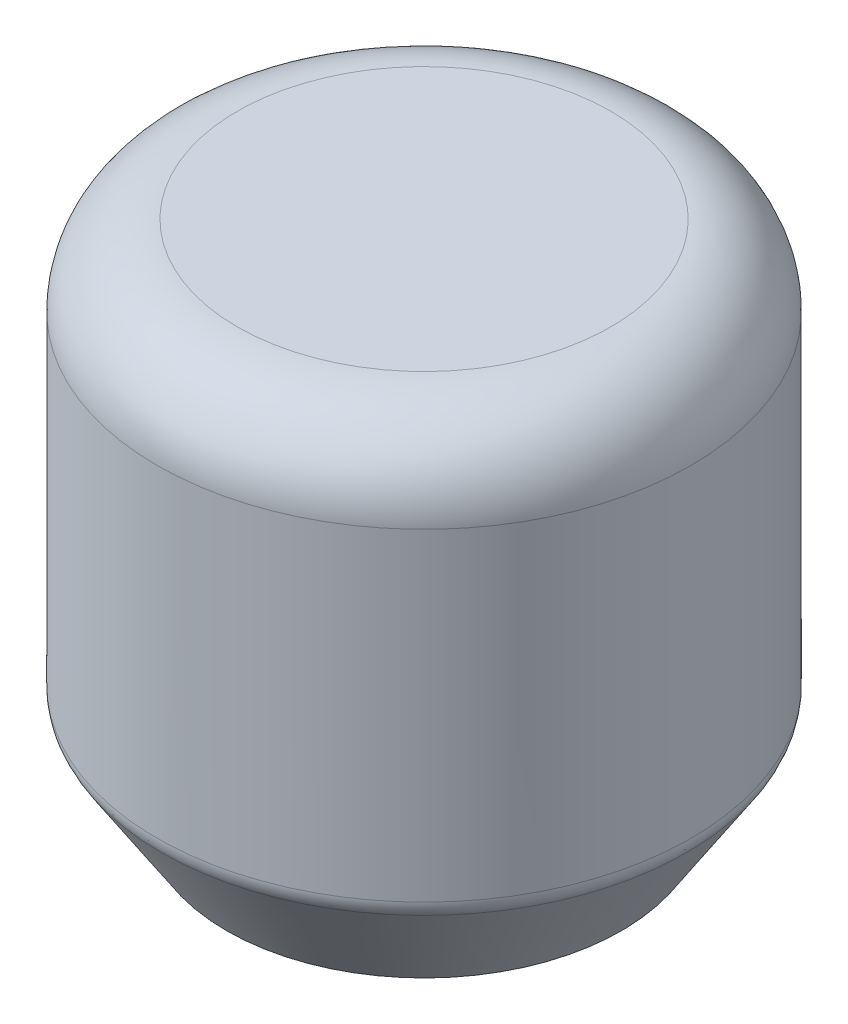
ISO-10303-21;
HEADER;
FILE_DESCRIPTION(('STEP AP214'),'2;1');
FILE_NAME('part.step','',(''),(''),'','','');
FILE_SCHEMA(('AUTOMOTIVE_DESIGN { 1 0 10303 214 1 1 1 1 }'));
ENDSEC;
DATA;
#1=APPLICATION_CONTEXT('core data for automotive mechanical design processes');
#2=APPLICATION_PROTOCOL_DEFINITION('international standard','automotive_design',2000,#1);
#3=PRODUCT_CONTEXT('',#1,'mechanical');
#4=PRODUCT('Part','Part','',(#3));
#5=PRODUCT_RELATED_PRODUCT_CATEGORY('part','',(#4));
#6=PRODUCT_DEFINITION_FORMATION('','',#4);
#7=PRODUCT_DEFINITION_CONTEXT('part definition',#1,'design');
#8=PRODUCT_DEFINITION('design','',#6,#7);
#9=PRODUCT_DEFINITION_SHAPE('','',#8);
#10=(LENGTH_UNIT() NAMED_UNIT(*) SI_UNIT(.MILLI.,.METRE.));
#11=(NAMED_UNIT(*) PLANE_ANGLE_UNIT() SI_UNIT($,.RADIAN.));
#12=(NAMED_UNIT(*) SI_UNIT($,.STERADIAN.) SOLID_ANGLE_UNIT());
#13=UNCERTAINTY_MEASURE_WITH_UNIT(LENGTH_MEASURE(1.E-05),#10,'distance_accuracy_value','');
#14=(GEOMETRIC_REPRESENTATION_CONTEXT(3) GLOBAL_UNCERTAINTY_ASSIGNED_CONTEXT((#13)) GLOBAL_UNIT_ASSIGNED_CONTEXT((#10,
#11,#12)) REPRESENTATION_CONTEXT('',''));
#15=CARTESIAN_POINT('',(0.,0.,0.));
#16=DIRECTION('',(0.,0.,1.));
#17=DIRECTION('',(1.,0.,0.));
#18=AXIS2_PLACEMENT_3D('',#15,#16,#17);
#19=CARTESIAN_POINT('',(0.,246.38,0.));
#20=DIRECTION('',(0.,-1.,0.));
#21=DIRECTION('',(0.,0.,-1.));
#22=AXIS2_PLACEMENT_3D('',#19,#20,#21);
#23=CYLINDRICAL_SURFACE('',#22,127.);
#24=CARTESIAN_POINT('',(0.,54.6082524911762,0.));
#25=DIRECTION('',(0.,-1.,0.));
#26=DIRECTION('',(0.,0.,-1.));
#27=AXIS2_PLACEMENT_3D('',#24,#25,#26);
#28=CIRCLE('',#27,127.);
#29=CARTESIAN_POINT('',(0.,54.6082524911762,-127.));
#30=VERTEX_POINT('',#29);
#31=EDGE_CURVE('E45',#30,#30,#28,.F.);
#32=CARTESIAN_POINT('',(0.,208.28,0.));
#33=DIRECTION('',(0.,1.,0.));
#34=DIRECTION('',(0.,0.,1.));
#35=AXIS2_PLACEMENT_3D('',#32,#33,#34);
#36=CIRCLE('',#35,127.);
#37=CARTESIAN_POINT('',(0.,208.28,-127.));
#38=VERTEX_POINT('',#37);
#39=EDGE_CURVE('E53',#38,#38,#36,.F.);
#40=CARTESIAN_POINT('',(0.,54.6082524911762,-127.));
#41=CARTESIAN_POINT('',(0.,56.2089998610598,-127.));
#42=CARTESIAN_POINT('',(0.,57.8097472309434,-127.));
#43=CARTESIAN_POINT('',(0.,61.0112419707105,-127.));
#44=CARTESIAN_POINT('',(0.,62.6119893405941,-127.));
#45=CARTESIAN_POINT('',(0.,65.8134840803613,-127.));
#46=CARTESIAN_POINT('',(0.,67.4142314502449,-127.));
#47=CARTESIAN_POINT('',(0.,70.615726190012,-127.));
#48=CARTESIAN_POINT('',(0.,72.2164735598956,-127.));
#49=CARTESIAN_POINT('',(0.,75.4179682996628,-127.));
#50=CARTESIAN_POINT('',(0.,77.0187156695464,-127.));
#51=CARTESIAN_POINT('',(0.,80.2202104093135,-127.));
#52=CARTESIAN_POINT('',(0.,81.8209577791971,-127.));
#53=CARTESIAN_POINT('',(0.,85.0224525189643,-127.));
#54=CARTESIAN_POINT('',(0.,86.6231998888478,-127.));
#55=CARTESIAN_POINT('',(0.,89.824694628615,-127.));
#56=CARTESIAN_POINT('',(0.,91.4254419984986,-127.));
#57=CARTESIAN_POINT('',(0.,94.6269367382658,-127.));
#58=CARTESIAN_POINT('',(0.,96.2276841081493,-127.));
#59=CARTESIAN_POINT('',(0.,99.4291788479165,-127.));
#60=CARTESIAN_POINT('',(0.,101.0299262178,-127.));
#61=CARTESIAN_POINT('',(0.,104.231420957567,-127.));
#62=CARTESIAN_POINT('',(0.,105.832168327451,-127.));
#63=CARTESIAN_POINT('',(0.,109.033663067218,-127.));
#64=CARTESIAN_POINT('',(0.,110.634410437102,-127.));
#65=CARTESIAN_POINT('',(0.,113.835905176869,-127.));
#66=CARTESIAN_POINT('',(0.,115.436652546752,-127.));
#67=CARTESIAN_POINT('',(0.,118.638147286519,-127.));
#68=CARTESIAN_POINT('',(0.,120.238894656403,-127.));
#69=CARTESIAN_POINT('',(0.,123.44038939617,-127.));
#70=CARTESIAN_POINT('',(0.,125.041136766054,-127.));
#71=CARTESIAN_POINT('',(0.,128.242631505821,-127.));
#72=CARTESIAN_POINT('',(0.,129.843378875705,-127.));
#73=CARTESIAN_POINT('',(0.,133.044873615472,-127.));
#74=CARTESIAN_POINT('',(0.,134.645620985355,-127.));
#75=CARTESIAN_POINT('',(0.,137.847115725122,-127.));
#76=CARTESIAN_POINT('',(0.,139.447863095006,-127.));
#77=CARTESIAN_POINT('',(0.,142.649357834773,-127.));
#78=CARTESIAN_POINT('',(0.,144.250105204657,-127.));
#79=CARTESIAN_POINT('',(0.,147.451599944424,-127.));
#80=CARTESIAN_POINT('',(0.,149.052347314307,-127.));
#81=CARTESIAN_POINT('',(0.,152.253842054075,-127.));
#82=CARTESIAN_POINT('',(0.,153.854589423958,-127.));
#83=CARTESIAN_POINT('',(0.,157.056084163725,-127.));
#84=CARTESIAN_POINT('',(0.,158.656831533609,-127.));
#85=CARTESIAN_POINT('',(0.,161.858326273376,-127.));
#86=CARTESIAN_POINT('',(0.,163.45907364326,-127.));
#87=CARTESIAN_POINT('',(0.,166.660568383027,-127.));
#88=CARTESIAN_POINT('',(0.,168.26131575291,-127.));
#89=CARTESIAN_POINT('',(0.,171.462810492678,-127.));
#90=CARTESIAN_POINT('',(0.,173.063557862561,-127.));
#91=CARTESIAN_POINT('',(0.,176.265052602328,-127.));
#92=CARTESIAN_POINT('',(0.,177.865799972212,-127.));
#93=CARTESIAN_POINT('',(0.,181.067294711979,-127.));
#94=CARTESIAN_POINT('',(0.,182.668042081863,-127.));
#95=CARTESIAN_POINT('',(0.,185.86953682163,-127.));
#96=CARTESIAN_POINT('',(0.,187.470284191513,-127.));
#97=CARTESIAN_POINT('',(0.,190.671778931281,-127.));
#98=CARTESIAN_POINT('',(0.,192.272526301164,-127.));
#99=CARTESIAN_POINT('',(0.,195.474021040931,-127.));
#100=CARTESIAN_POINT('',(0.,197.074768410815,-127.));
#101=CARTESIAN_POINT('',(0.,200.276263150582,-127.));
#102=CARTESIAN_POINT('',(0.,201.877010520466,-127.));
#103=CARTESIAN_POINT('',(0.,205.078505260233,-127.));
#104=CARTESIAN_POINT('',(0.,206.679252630116,-127.));
#105=CARTESIAN_POINT('',(0.,208.28,-127.));
#106=B_SPLINE_CURVE_WITH_KNOTS('',3,(#40,#41,#42,#43,#44,#45,#46,#47,#48,#49,#50,#51,#52,#53,
#54,#55,#56,#57,#58,#59,#60,#61,#62,#63,#64,#65,#66,#67,#68,#69,#70,#71,#72,#73,#74,#75,#76,#77,
#78,#79,#80,#81,#82,#83,#84,#85,#86,#87,#88,#89,#90,#91,#92,#93,#94,#95,#96,#97,#98,#99,#100,
#101,#102,#103,#104,#105),.UNSPECIFIED.,.F.,.F.,(4,2,2,2,2,2,2,2,2,2,2,2,2,2,2,2,2,2,2,2,2,2,2,
2,2,2,2,2,2,2,2,2,4),(0.,4.80224210965075,9.60448421930149,14.4067263289522,19.208968438603,
24.0112105482537,28.8134526579045,33.6156947675552,38.417936877206,43.2201789868567,
48.0224210965075,52.8246632061582,57.6269053158089,62.4291474254597,67.2313895351104,
72.0336316447611,76.8358737544119,81.6381158640626,86.4403579737134,91.2426000833641,
96.0448421930149,100.847084302666,105.649326412316,110.451568521967,115.253810631618,
120.056052741269,124.858294850919,129.66053696057,134.462779070221,139.265021179872,
144.067263289522,148.869505399173,153.671747508824),.UNSPECIFIED.);
#107=EDGE_CURVE('BSEAM38',#30,#38,#106,.T.);
#108=ORIENTED_EDGE('',*,*,#31,.T.);
#109=ORIENTED_EDGE('',*,*,#39,.T.);
#110=ORIENTED_EDGE('',*,*,#107,.T.);
#111=ORIENTED_EDGE('',*,*,#107,.F.);
#112=EDGE_LOOP('',(#108,#110,#109,#111));
#113=FACE_BOUND('',#112,.T.);
#114=ADVANCED_FACE('F38',(#113),#23,.T.);
#115=CARTESIAN_POINT('',(0.,246.38,0.));
#116=DIRECTION('',(0.,1.,0.));
#117=DIRECTION('',(0.,0.,1.));
#118=AXIS2_PLACEMENT_3D('',#115,#116,#117);
#119=PLANE('',#118);
#120=CARTESIAN_POINT('',(0.,246.38,0.));
#121=DIRECTION('',(0.,1.,0.));
#122=DIRECTION('',(0.,0.,1.));
#123=AXIS2_PLACEMENT_3D('',#120,#121,#122);
#124=CIRCLE('',#123,88.9);
#125=CARTESIAN_POINT('',(0.,246.38,88.9));
#126=VERTEX_POINT('',#125);
#127=EDGE_CURVE('E58',#126,#126,#124,.T.);
#128=ORIENTED_EDGE('',*,*,#127,.T.);
#129=EDGE_LOOP('',(#128));
#130=FACE_BOUND('',#129,.T.);
#131=ADVANCED_FACE('F62',(#130),#119,.T.);
#132=CARTESIAN_POINT('',(0.,0.,0.));
#133=DIRECTION('',(0.,1.,0.));
#134=DIRECTION('',(0.,0.,1.));
#135=AXIS2_PLACEMENT_3D('',#132,#133,#134);
#136=PLANE('',#135);
#137=CARTESIAN_POINT('',(0.,0.,0.));
#138=DIRECTION('',(0.,1.,0.));
#139=DIRECTION('',(0.,0.,1.));
#140=AXIS2_PLACEMENT_3D('',#137,#138,#139);
#141=CIRCLE('',#140,93.9799999999998);
#142=CARTESIAN_POINT('',(0.,0.,93.9799999999998));
#143=VERTEX_POINT('',#142);
#144=EDGE_CURVE('E49',#143,#143,#141,.F.);
#145=ORIENTED_EDGE('',*,*,#144,.T.);
#146=EDGE_LOOP('',(#145));
#147=FACE_BOUND('',#146,.T.);
#148=ADVANCED_FACE('F67',(#147),#136,.F.);
#149=CARTESIAN_POINT('',(0.,208.28,0.));
#150=DIRECTION('',(0.,1.,0.));
#151=DIRECTION('',(0.,0.,1.));
#152=AXIS2_PLACEMENT_3D('',#149,#150,#151);
#153=TOROIDAL_SURFACE('',#152,88.9,38.1);
#154=ORIENTED_EDGE('',*,*,#39,.F.);
#155=EDGE_LOOP('',(#154));
#156=FACE_BOUND('',#155,.T.);
#157=ORIENTED_EDGE('',*,*,#127,.F.);
#158=EDGE_LOOP('',(#157));
#159=FACE_BOUND('',#158,.T.);
#160=ADVANCED_FACE('F64',(#156,#159),#153,.T.);
#161=CARTESIAN_POINT('',(0.,50.8463411051578,0.));
#162=DIRECTION('',(0.,1.,0.));
#163=DIRECTION('',(0.,0.,1.));
#164=AXIS2_PLACEMENT_3D('',#161,#162,#163);
#165=CONICAL_SURFACE('',#164,127.,0.57595865315813);
#166=CARTESIAN_POINT('',(0.,47.6913367464853,0.));
#167=DIRECTION('',(0.,1.,0.));
#168=DIRECTION('',(0.,0.,1.));
#169=AXIS2_PLACEMENT_3D('',#166,#167,#168);
#170=CIRCLE('',#169,124.951116212907);
#171=CARTESIAN_POINT('',(0.,47.6913367464853,124.951116212907));
#172=VERTEX_POINT('',#171);
#173=EDGE_CURVE('E10',#172,#172,#170,.F.);
#174=ORIENTED_EDGE('',*,*,#173,.T.);
#175=EDGE_LOOP('',(#174));
#176=FACE_BOUND('',#175,.T.);
#177=ORIENTED_EDGE('',*,*,#144,.F.);
#178=EDGE_LOOP('',(#177));
#179=FACE_BOUND('',#178,.T.);
#180=ADVANCED_FACE('F66',(#176,#179),#165,.T.);
#181=CARTESIAN_POINT('',(0.,54.6082524911762,0.));
#182=DIRECTION('',(0.,-1.,0.));
#183=DIRECTION('',(0.,0.,-1.));
#184=AXIS2_PLACEMENT_3D('',#181,#182,#183);
#185=TOROIDAL_SURFACE('',#184,114.3,12.7);
#186=ORIENTED_EDGE('',*,*,#173,.F.);
#187=EDGE_LOOP('',(#186));
#188=FACE_BOUND('',#187,.T.);
#189=ORIENTED_EDGE('',*,*,#31,.F.);
#190=EDGE_LOOP('',(#189));
#191=FACE_BOUND('',#190,.T.);
#192=ADVANCED_FACE('F40',(#188,#191),#185,.T.);
#193=CLOSED_SHELL('',(#114,#131,#148,#160,#180,#192));
#194=MANIFOLD_SOLID_BREP('B2',#193);
#195=ADVANCED_BREP_SHAPE_REPRESENTATION('',(#18,#194),#14);
#196=SHAPE_DEFINITION_REPRESENTATION(#9,#195);
ENDSEC;
END-ISO-10303-21;
